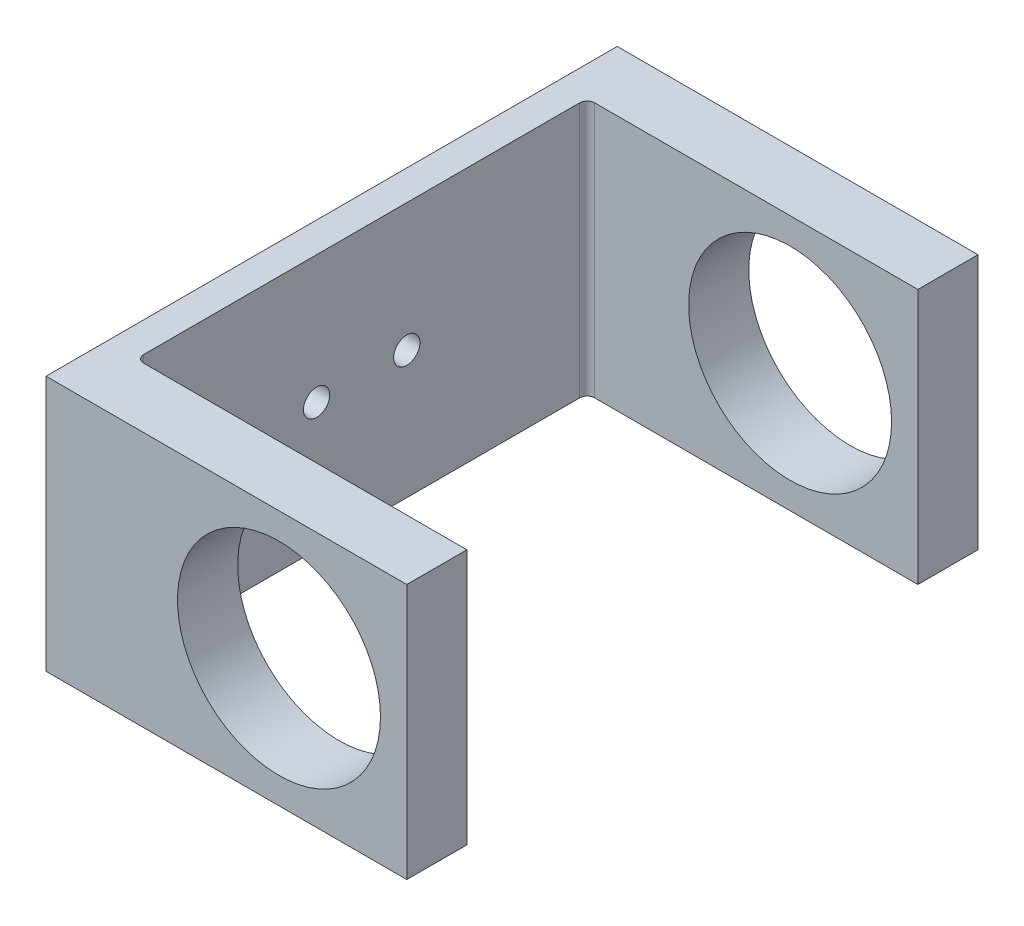
ISO-10303-21;
HEADER;
FILE_DESCRIPTION(('STEP AP214'),'2;1');
FILE_NAME('part.step','',(''),(''),'','','');
FILE_SCHEMA(('AUTOMOTIVE_DESIGN { 1 0 10303 214 1 1 1 1 }'));
ENDSEC;
DATA;
#1=APPLICATION_CONTEXT('core data for automotive mechanical design processes');
#2=APPLICATION_PROTOCOL_DEFINITION('international standard','automotive_design',2000,#1);
#3=PRODUCT_CONTEXT('',#1,'mechanical');
#4=PRODUCT('Part','Part','',(#3));
#5=PRODUCT_RELATED_PRODUCT_CATEGORY('part','',(#4));
#6=PRODUCT_DEFINITION_FORMATION('','',#4);
#7=PRODUCT_DEFINITION_CONTEXT('part definition',#1,'design');
#8=PRODUCT_DEFINITION('design','',#6,#7);
#9=PRODUCT_DEFINITION_SHAPE('','',#8);
#10=(LENGTH_UNIT() NAMED_UNIT(*) SI_UNIT(.MILLI.,.METRE.));
#11=(NAMED_UNIT(*) PLANE_ANGLE_UNIT() SI_UNIT($,.RADIAN.));
#12=(NAMED_UNIT(*) SI_UNIT($,.STERADIAN.) SOLID_ANGLE_UNIT());
#13=UNCERTAINTY_MEASURE_WITH_UNIT(LENGTH_MEASURE(1.E-05),#10,'distance_accuracy_value','');
#14=(GEOMETRIC_REPRESENTATION_CONTEXT(3) GLOBAL_UNCERTAINTY_ASSIGNED_CONTEXT((#13)) GLOBAL_UNIT_ASSIGNED_CONTEXT((#10,
#11,#12)) REPRESENTATION_CONTEXT('',''));
#15=CARTESIAN_POINT('',(0.,0.,0.));
#16=DIRECTION('',(0.,0.,1.));
#17=DIRECTION('',(1.,0.,0.));
#18=AXIS2_PLACEMENT_3D('',#15,#16,#17);
#19=CARTESIAN_POINT('',(-4.,-17.,30.));
#20=DIRECTION('',(0.,-1.,0.));
#21=DIRECTION('',(0.,0.,-1.));
#22=AXIS2_PLACEMENT_3D('',#19,#20,#21);
#23=PLANE('',#22);
#24=DIRECTION('',(0.,0.,-1.));
#25=VECTOR('',#24,1.);
#26=CARTESIAN_POINT('',(0.,-17.,30.));
#27=LINE('',#26,#25);
#28=CARTESIAN_POINT('',(0.,-17.,29.));
#29=VERTEX_POINT('',#28);
#30=CARTESIAN_POINT('',(0.,-17.,-29.));
#31=VERTEX_POINT('',#30);
#32=EDGE_CURVE('E128',#29,#31,#27,.T.);
#33=ORIENTED_EDGE('',*,*,#32,.F.);
#34=CARTESIAN_POINT('',(1.,-17.,29.));
#35=DIRECTION('',(0.,-1.,0.));
#36=DIRECTION('',(0.,0.,-1.));
#37=AXIS2_PLACEMENT_3D('',#34,#35,#36);
#38=CIRCLE('',#37,1.);
#39=CARTESIAN_POINT('',(1.,-17.,30.));
#40=VERTEX_POINT('',#39);
#41=EDGE_CURVE('E236',#29,#40,#38,.F.);
#42=ORIENTED_EDGE('',*,*,#41,.T.);
#43=DIRECTION('',(1.,0.,0.));
#44=VECTOR('',#43,1.);
#45=CARTESIAN_POINT('',(-4.,-17.,30.));
#46=LINE('',#45,#44);
#47=CARTESIAN_POINT('',(44.,-17.,30.));
#48=VERTEX_POINT('',#47);
#49=EDGE_CURVE('E173',#40,#48,#46,.T.);
#50=ORIENTED_EDGE('',*,*,#49,.T.);
#51=DIRECTION('',(0.,0.,-1.));
#52=VECTOR('',#51,1.);
#53=CARTESIAN_POINT('',(44.,-17.,38.));
#54=LINE('',#53,#52);
#55=CARTESIAN_POINT('',(44.,-17.,38.));
#56=VERTEX_POINT('',#55);
#57=EDGE_CURVE('E201',#56,#48,#54,.T.);
#58=ORIENTED_EDGE('',*,*,#57,.F.);
#59=DIRECTION('',(1.,0.,0.));
#60=VECTOR('',#59,1.);
#61=CARTESIAN_POINT('',(-4.,-17.,38.));
#62=LINE('',#61,#60);
#63=CARTESIAN_POINT('',(-4.,-17.,38.));
#64=VERTEX_POINT('',#63);
#65=EDGE_CURVE('E179',#64,#56,#62,.T.);
#66=ORIENTED_EDGE('',*,*,#65,.F.);
#67=DIRECTION('',(0.,0.,-1.));
#68=VECTOR('',#67,1.);
#69=CARTESIAN_POINT('',(-4.,-17.,30.));
#70=LINE('',#69,#68);
#71=CARTESIAN_POINT('',(-4.,-17.,-38.));
#72=VERTEX_POINT('',#71);
#73=EDGE_CURVE('E127',#64,#72,#70,.T.);
#74=ORIENTED_EDGE('',*,*,#73,.T.);
#75=DIRECTION('',(1.,0.,0.));
#76=VECTOR('',#75,1.);
#77=CARTESIAN_POINT('',(-4.,-17.,-38.));
#78=LINE('',#77,#76);
#79=CARTESIAN_POINT('',(44.,-17.,-38.));
#80=VERTEX_POINT('',#79);
#81=EDGE_CURVE('E137',#72,#80,#78,.T.);
#82=ORIENTED_EDGE('',*,*,#81,.T.);
#83=DIRECTION('',(0.,0.,1.));
#84=VECTOR('',#83,1.);
#85=CARTESIAN_POINT('',(44.,-17.,-38.));
#86=LINE('',#85,#84);
#87=CARTESIAN_POINT('',(44.,-17.,-30.));
#88=VERTEX_POINT('',#87);
#89=EDGE_CURVE('E152',#80,#88,#86,.T.);
#90=ORIENTED_EDGE('',*,*,#89,.T.);
#91=DIRECTION('',(1.,0.,0.));
#92=VECTOR('',#91,1.);
#93=CARTESIAN_POINT('',(-4.,-17.,-30.));
#94=LINE('',#93,#92);
#95=CARTESIAN_POINT('',(1.,-17.,-30.));
#96=VERTEX_POINT('',#95);
#97=EDGE_CURVE('E139',#96,#88,#94,.T.);
#98=ORIENTED_EDGE('',*,*,#97,.F.);
#99=CARTESIAN_POINT('',(1.,-17.,-29.));
#100=DIRECTION('',(0.,-1.,0.));
#101=DIRECTION('',(0.,0.,-1.));
#102=AXIS2_PLACEMENT_3D('',#99,#100,#101);
#103=CIRCLE('',#102,1.);
#104=EDGE_CURVE('E11',#96,#31,#103,.F.);
#105=ORIENTED_EDGE('',*,*,#104,.T.);
#106=EDGE_LOOP('',(#33,#42,#50,#58,#66,#74,#82,#90,#98,#105));
#107=FACE_BOUND('',#106,.T.);
#108=ADVANCED_FACE('F39',(#107),#23,.T.);
#109=CARTESIAN_POINT('',(-4.,17.,30.));
#110=DIRECTION('',(0.,1.,0.));
#111=DIRECTION('',(0.,0.,1.));
#112=AXIS2_PLACEMENT_3D('',#109,#110,#111);
#113=PLANE('',#112);
#114=DIRECTION('',(0.,0.,1.));
#115=VECTOR('',#114,1.);
#116=CARTESIAN_POINT('',(0.,17.,30.));
#117=LINE('',#116,#115);
#118=CARTESIAN_POINT('',(0.,17.,-29.));
#119=VERTEX_POINT('',#118);
#120=CARTESIAN_POINT('',(0.,17.,29.));
#121=VERTEX_POINT('',#120);
#122=EDGE_CURVE('E218',#119,#121,#117,.T.);
#123=ORIENTED_EDGE('',*,*,#122,.F.);
#124=CARTESIAN_POINT('',(1.,17.,-29.));
#125=DIRECTION('',(0.,1.,0.));
#126=DIRECTION('',(0.,0.,1.));
#127=AXIS2_PLACEMENT_3D('',#124,#125,#126);
#128=CIRCLE('',#127,1.);
#129=CARTESIAN_POINT('',(1.,17.,-30.));
#130=VERTEX_POINT('',#129);
#131=EDGE_CURVE('E48',#119,#130,#128,.F.);
#132=ORIENTED_EDGE('',*,*,#131,.T.);
#133=DIRECTION('',(-1.,0.,0.));
#134=VECTOR('',#133,1.);
#135=CARTESIAN_POINT('',(-4.,17.,-30.));
#136=LINE('',#135,#134);
#137=CARTESIAN_POINT('',(44.,17.,-30.));
#138=VERTEX_POINT('',#137);
#139=EDGE_CURVE('E153',#138,#130,#136,.T.);
#140=ORIENTED_EDGE('',*,*,#139,.F.);
#141=DIRECTION('',(0.,0.,1.));
#142=VECTOR('',#141,1.);
#143=CARTESIAN_POINT('',(44.,17.,-38.));
#144=LINE('',#143,#142);
#145=CARTESIAN_POINT('',(44.,17.,-38.));
#146=VERTEX_POINT('',#145);
#147=EDGE_CURVE('E142',#146,#138,#144,.T.);
#148=ORIENTED_EDGE('',*,*,#147,.F.);
#149=DIRECTION('',(-1.,0.,0.));
#150=VECTOR('',#149,1.);
#151=CARTESIAN_POINT('',(-4.,17.,-38.));
#152=LINE('',#151,#150);
#153=CARTESIAN_POINT('',(-4.,17.,-38.));
#154=VERTEX_POINT('',#153);
#155=EDGE_CURVE('E134',#146,#154,#152,.T.);
#156=ORIENTED_EDGE('',*,*,#155,.T.);
#157=DIRECTION('',(0.,0.,1.));
#158=VECTOR('',#157,1.);
#159=CARTESIAN_POINT('',(-4.,17.,30.));
#160=LINE('',#159,#158);
#161=CARTESIAN_POINT('',(-4.,17.,38.));
#162=VERTEX_POINT('',#161);
#163=EDGE_CURVE('E116',#154,#162,#160,.T.);
#164=ORIENTED_EDGE('',*,*,#163,.T.);
#165=DIRECTION('',(-1.,0.,0.));
#166=VECTOR('',#165,1.);
#167=CARTESIAN_POINT('',(-4.,17.,38.));
#168=LINE('',#167,#166);
#169=CARTESIAN_POINT('',(44.,17.,38.));
#170=VERTEX_POINT('',#169);
#171=EDGE_CURVE('E186',#170,#162,#168,.T.);
#172=ORIENTED_EDGE('',*,*,#171,.F.);
#173=DIRECTION('',(0.,0.,-1.));
#174=VECTOR('',#173,1.);
#175=CARTESIAN_POINT('',(44.,17.,38.));
#176=LINE('',#175,#174);
#177=CARTESIAN_POINT('',(44.,17.,30.));
#178=VERTEX_POINT('',#177);
#179=EDGE_CURVE('E189',#170,#178,#176,.T.);
#180=ORIENTED_EDGE('',*,*,#179,.T.);
#181=DIRECTION('',(-1.,0.,0.));
#182=VECTOR('',#181,1.);
#183=CARTESIAN_POINT('',(-4.,17.,30.));
#184=LINE('',#183,#182);
#185=CARTESIAN_POINT('',(1.,17.,30.));
#186=VERTEX_POINT('',#185);
#187=EDGE_CURVE('E180',#178,#186,#184,.T.);
#188=ORIENTED_EDGE('',*,*,#187,.T.);
#189=CARTESIAN_POINT('',(1.,17.,29.));
#190=DIRECTION('',(0.,1.,0.));
#191=DIRECTION('',(0.,0.,1.));
#192=AXIS2_PLACEMENT_3D('',#189,#190,#191);
#193=CIRCLE('',#192,1.);
#194=EDGE_CURVE('E239',#186,#121,#193,.F.);
#195=ORIENTED_EDGE('',*,*,#194,.T.);
#196=EDGE_LOOP('',(#123,#132,#140,#148,#156,#164,#172,#180,#188,#195));
#197=FACE_BOUND('',#196,.T.);
#198=ADVANCED_FACE('F141',(#197),#113,.T.);
#199=CARTESIAN_POINT('',(-4.,0.,0.));
#200=DIRECTION('',(1.,0.,0.));
#201=DIRECTION('',(0.,0.,-1.));
#202=AXIS2_PLACEMENT_3D('',#199,#200,#201);
#203=PLANE('',#202);
#204=CARTESIAN_POINT('',(-4.,0.,-6.));
#205=DIRECTION('',(1.,0.,0.));
#206=DIRECTION('',(0.,0.,1.));
#207=AXIS2_PLACEMENT_3D('',#204,#205,#206);
#208=CIRCLE('',#207,1.75);
#209=CARTESIAN_POINT('',(-4.,0.,-4.25));
#210=VERTEX_POINT('',#209);
#211=EDGE_CURVE('E206',#210,#210,#208,.T.);
#212=ORIENTED_EDGE('',*,*,#211,.T.);
#213=EDGE_LOOP('',(#212));
#214=FACE_BOUND('',#213,.T.);
#215=CARTESIAN_POINT('',(-4.,0.,6.));
#216=DIRECTION('',(1.,0.,0.));
#217=DIRECTION('',(0.,0.,-1.));
#218=AXIS2_PLACEMENT_3D('',#215,#216,#217);
#219=CIRCLE('',#218,1.75);
#220=CARTESIAN_POINT('',(-4.,0.,4.25));
#221=VERTEX_POINT('',#220);
#222=EDGE_CURVE('E214',#221,#221,#219,.T.);
#223=ORIENTED_EDGE('',*,*,#222,.T.);
#224=EDGE_LOOP('',(#223));
#225=FACE_BOUND('',#224,.T.);
#226=ORIENTED_EDGE('',*,*,#163,.F.);
#227=DIRECTION('',(0.,-1.,0.));
#228=VECTOR('',#227,1.);
#229=CARTESIAN_POINT('',(-4.,17.,-38.));
#230=LINE('',#229,#228);
#231=EDGE_CURVE('E119',#154,#72,#230,.T.);
#232=ORIENTED_EDGE('',*,*,#231,.T.);
#233=ORIENTED_EDGE('',*,*,#73,.F.);
#234=DIRECTION('',(0.,-1.,0.));
#235=VECTOR('',#234,1.);
#236=CARTESIAN_POINT('',(-4.,17.,38.));
#237=LINE('',#236,#235);
#238=EDGE_CURVE('E122',#162,#64,#237,.T.);
#239=ORIENTED_EDGE('',*,*,#238,.F.);
#240=EDGE_LOOP('',(#226,#232,#233,#239));
#241=FACE_BOUND('',#240,.T.);
#242=ADVANCED_FACE('F118',(#214,#225,#241),#203,.F.);
#243=CARTESIAN_POINT('',(0.,0.,0.));
#244=DIRECTION('',(1.,0.,0.));
#245=DIRECTION('',(0.,0.,-1.));
#246=AXIS2_PLACEMENT_3D('',#243,#244,#245);
#247=PLANE('',#246);
#248=CARTESIAN_POINT('',(0.,0.,-6.));
#249=DIRECTION('',(1.,0.,0.));
#250=DIRECTION('',(0.,0.,1.));
#251=AXIS2_PLACEMENT_3D('',#248,#249,#250);
#252=CIRCLE('',#251,1.75);
#253=CARTESIAN_POINT('',(0.,0.,-4.25));
#254=VERTEX_POINT('',#253);
#255=EDGE_CURVE('E205',#254,#254,#252,.T.);
#256=ORIENTED_EDGE('',*,*,#255,.F.);
#257=EDGE_LOOP('',(#256));
#258=FACE_BOUND('',#257,.T.);
#259=CARTESIAN_POINT('',(0.,0.,6.));
#260=DIRECTION('',(1.,0.,0.));
#261=DIRECTION('',(0.,0.,-1.));
#262=AXIS2_PLACEMENT_3D('',#259,#260,#261);
#263=CIRCLE('',#262,1.75);
#264=CARTESIAN_POINT('',(0.,0.,4.25));
#265=VERTEX_POINT('',#264);
#266=EDGE_CURVE('E210',#265,#265,#263,.T.);
#267=ORIENTED_EDGE('',*,*,#266,.F.);
#268=EDGE_LOOP('',(#267));
#269=FACE_BOUND('',#268,.T.);
#270=ORIENTED_EDGE('',*,*,#32,.T.);
#271=DIRECTION('',(0.,1.,0.));
#272=VECTOR('',#271,1.);
#273=CARTESIAN_POINT('',(0.,0.,-29.));
#274=LINE('',#273,#272);
#275=EDGE_CURVE('E243',#31,#119,#274,.T.);
#276=ORIENTED_EDGE('',*,*,#275,.T.);
#277=ORIENTED_EDGE('',*,*,#122,.T.);
#278=DIRECTION('',(0.,-1.,0.));
#279=VECTOR('',#278,1.);
#280=CARTESIAN_POINT('',(0.,0.,29.));
#281=LINE('',#280,#279);
#282=EDGE_CURVE('E224',#121,#29,#281,.T.);
#283=ORIENTED_EDGE('',*,*,#282,.T.);
#284=EDGE_LOOP('',(#270,#276,#277,#283));
#285=FACE_BOUND('',#284,.T.);
#286=ADVANCED_FACE('F251',(#258,#269,#285),#247,.T.);
#287=CARTESIAN_POINT('',(-4.,0.,6.));
#288=DIRECTION('',(1.,0.,0.));
#289=DIRECTION('',(0.,0.,-1.));
#290=AXIS2_PLACEMENT_3D('',#287,#288,#289);
#291=CYLINDRICAL_SURFACE('',#290,1.75);
#292=ORIENTED_EDGE('',*,*,#222,.F.);
#293=EDGE_LOOP('',(#292));
#294=FACE_BOUND('',#293,.T.);
#295=ORIENTED_EDGE('',*,*,#266,.T.);
#296=EDGE_LOOP('',(#295));
#297=FACE_BOUND('',#296,.T.);
#298=ADVANCED_FACE('F277',(#294,#297),#291,.F.);
#299=CARTESIAN_POINT('',(-4.,0.,-6.));
#300=DIRECTION('',(1.,0.,0.));
#301=DIRECTION('',(0.,0.,-1.));
#302=AXIS2_PLACEMENT_3D('',#299,#300,#301);
#303=CYLINDRICAL_SURFACE('',#302,1.75);
#304=ORIENTED_EDGE('',*,*,#211,.F.);
#305=EDGE_LOOP('',(#304));
#306=FACE_BOUND('',#305,.T.);
#307=ORIENTED_EDGE('',*,*,#255,.T.);
#308=EDGE_LOOP('',(#307));
#309=FACE_BOUND('',#308,.T.);
#310=ADVANCED_FACE('F284',(#306,#309),#303,.F.);
#311=CARTESIAN_POINT('',(0.,0.,38.));
#312=DIRECTION('',(0.,0.,1.));
#313=DIRECTION('',(1.,0.,0.));
#314=AXIS2_PLACEMENT_3D('',#311,#312,#313);
#315=PLANE('',#314);
#316=ORIENTED_EDGE('',*,*,#238,.T.);
#317=ORIENTED_EDGE('',*,*,#65,.T.);
#318=DIRECTION('',(0.,1.,0.));
#319=VECTOR('',#318,1.);
#320=CARTESIAN_POINT('',(44.,17.,38.));
#321=LINE('',#320,#319);
#322=EDGE_CURVE('E183',#56,#170,#321,.T.);
#323=ORIENTED_EDGE('',*,*,#322,.T.);
#324=ORIENTED_EDGE('',*,*,#171,.T.);
#325=EDGE_LOOP('',(#316,#317,#323,#324));
#326=FACE_BOUND('',#325,.T.);
#327=CARTESIAN_POINT('',(27.,0.,38.));
#328=DIRECTION('',(0.,0.,1.));
#329=DIRECTION('',(1.,0.,0.));
#330=AXIS2_PLACEMENT_3D('',#327,#328,#329);
#331=CIRCLE('',#330,13.5);
#332=CARTESIAN_POINT('',(40.5,0.,38.));
#333=VERTEX_POINT('',#332);
#334=EDGE_CURVE('E169',#333,#333,#331,.T.);
#335=ORIENTED_EDGE('',*,*,#334,.F.);
#336=EDGE_LOOP('',(#335));
#337=FACE_BOUND('',#336,.T.);
#338=ADVANCED_FACE('F288',(#326,#337),#315,.T.);
#339=CARTESIAN_POINT('',(0.,0.,30.));
#340=DIRECTION('',(0.,0.,1.));
#341=DIRECTION('',(1.,0.,0.));
#342=AXIS2_PLACEMENT_3D('',#339,#340,#341);
#343=PLANE('',#342);
#344=ORIENTED_EDGE('',*,*,#49,.F.);
#345=DIRECTION('',(0.,-1.,0.));
#346=VECTOR('',#345,1.);
#347=CARTESIAN_POINT('',(1.,0.,30.));
#348=LINE('',#347,#346);
#349=EDGE_CURVE('E233',#40,#186,#348,.F.);
#350=ORIENTED_EDGE('',*,*,#349,.T.);
#351=ORIENTED_EDGE('',*,*,#187,.F.);
#352=DIRECTION('',(0.,1.,0.));
#353=VECTOR('',#352,1.);
#354=CARTESIAN_POINT('',(44.,17.,30.));
#355=LINE('',#354,#353);
#356=EDGE_CURVE('E192',#48,#178,#355,.T.);
#357=ORIENTED_EDGE('',*,*,#356,.F.);
#358=EDGE_LOOP('',(#344,#350,#351,#357));
#359=FACE_BOUND('',#358,.T.);
#360=CARTESIAN_POINT('',(27.,0.,30.));
#361=DIRECTION('',(0.,0.,1.));
#362=DIRECTION('',(1.,0.,0.));
#363=AXIS2_PLACEMENT_3D('',#360,#361,#362);
#364=CIRCLE('',#363,13.5);
#365=CARTESIAN_POINT('',(40.5,0.,30.));
#366=VERTEX_POINT('',#365);
#367=EDGE_CURVE('E168',#366,#366,#364,.T.);
#368=ORIENTED_EDGE('',*,*,#367,.T.);
#369=EDGE_LOOP('',(#368));
#370=FACE_BOUND('',#369,.T.);
#371=ADVANCED_FACE('F294',(#359,#370),#343,.F.);
#372=CARTESIAN_POINT('',(44.,17.,38.));
#373=DIRECTION('',(-1.,0.,0.));
#374=DIRECTION('',(0.,-1.,0.));
#375=AXIS2_PLACEMENT_3D('',#372,#373,#374);
#376=PLANE('',#375);
#377=ORIENTED_EDGE('',*,*,#356,.T.);
#378=ORIENTED_EDGE('',*,*,#179,.F.);
#379=ORIENTED_EDGE('',*,*,#322,.F.);
#380=ORIENTED_EDGE('',*,*,#57,.T.);
#381=EDGE_LOOP('',(#377,#378,#379,#380));
#382=FACE_BOUND('',#381,.T.);
#383=ADVANCED_FACE('F290',(#382),#376,.F.);
#384=CARTESIAN_POINT('',(27.,0.,38.));
#385=DIRECTION('',(0.,0.,-1.));
#386=DIRECTION('',(-1.,0.,0.));
#387=AXIS2_PLACEMENT_3D('',#384,#385,#386);
#388=CYLINDRICAL_SURFACE('',#387,13.5);
#389=ORIENTED_EDGE('',*,*,#334,.T.);
#390=EDGE_LOOP('',(#389));
#391=FACE_BOUND('',#390,.T.);
#392=ORIENTED_EDGE('',*,*,#367,.F.);
#393=EDGE_LOOP('',(#392));
#394=FACE_BOUND('',#393,.T.);
#395=ADVANCED_FACE('F293',(#391,#394),#388,.F.);
#396=CARTESIAN_POINT('',(44.,17.,-38.));
#397=DIRECTION('',(1.,0.,0.));
#398=DIRECTION('',(0.,1.,0.));
#399=AXIS2_PLACEMENT_3D('',#396,#397,#398);
#400=PLANE('',#399);
#401=DIRECTION('',(0.,1.,0.));
#402=VECTOR('',#401,1.);
#403=CARTESIAN_POINT('',(44.,17.,-30.));
#404=LINE('',#403,#402);
#405=EDGE_CURVE('E156',#88,#138,#404,.T.);
#406=ORIENTED_EDGE('',*,*,#405,.F.);
#407=ORIENTED_EDGE('',*,*,#89,.F.);
#408=DIRECTION('',(0.,1.,0.));
#409=VECTOR('',#408,1.);
#410=CARTESIAN_POINT('',(44.,17.,-38.));
#411=LINE('',#410,#409);
#412=EDGE_CURVE('E144',#80,#146,#411,.T.);
#413=ORIENTED_EDGE('',*,*,#412,.T.);
#414=ORIENTED_EDGE('',*,*,#147,.T.);
#415=EDGE_LOOP('',(#406,#407,#413,#414));
#416=FACE_BOUND('',#415,.T.);
#417=ADVANCED_FACE('F304',(#416),#400,.T.);
#418=CARTESIAN_POINT('',(0.,0.,-38.));
#419=DIRECTION('',(0.,0.,-1.));
#420=DIRECTION('',(1.,0.,0.));
#421=AXIS2_PLACEMENT_3D('',#418,#419,#420);
#422=PLANE('',#421);
#423=CARTESIAN_POINT('',(27.,0.,-38.));
#424=DIRECTION('',(0.,0.,1.));
#425=DIRECTION('',(1.,0.,0.));
#426=AXIS2_PLACEMENT_3D('',#423,#424,#425);
#427=CIRCLE('',#426,13.5);
#428=CARTESIAN_POINT('',(40.5,0.,-38.));
#429=VERTEX_POINT('',#428);
#430=EDGE_CURVE('E157',#429,#429,#427,.T.);
#431=ORIENTED_EDGE('',*,*,#430,.T.);
#432=EDGE_LOOP('',(#431));
#433=FACE_BOUND('',#432,.T.);
#434=ORIENTED_EDGE('',*,*,#231,.F.);
#435=ORIENTED_EDGE('',*,*,#155,.F.);
#436=ORIENTED_EDGE('',*,*,#412,.F.);
#437=ORIENTED_EDGE('',*,*,#81,.F.);
#438=EDGE_LOOP('',(#434,#435,#436,#437));
#439=FACE_BOUND('',#438,.T.);
#440=ADVANCED_FACE('F132',(#433,#439),#422,.T.);
#441=CARTESIAN_POINT('',(0.,0.,-30.));
#442=DIRECTION('',(0.,0.,-1.));
#443=DIRECTION('',(1.,0.,0.));
#444=AXIS2_PLACEMENT_3D('',#441,#442,#443);
#445=PLANE('',#444);
#446=ORIENTED_EDGE('',*,*,#139,.T.);
#447=DIRECTION('',(0.,1.,0.));
#448=VECTOR('',#447,1.);
#449=CARTESIAN_POINT('',(1.,0.,-30.));
#450=LINE('',#449,#448);
#451=EDGE_CURVE('E61',#130,#96,#450,.F.);
#452=ORIENTED_EDGE('',*,*,#451,.T.);
#453=ORIENTED_EDGE('',*,*,#97,.T.);
#454=ORIENTED_EDGE('',*,*,#405,.T.);
#455=EDGE_LOOP('',(#446,#452,#453,#454));
#456=FACE_BOUND('',#455,.T.);
#457=CARTESIAN_POINT('',(27.,0.,-30.));
#458=DIRECTION('',(0.,0.,1.));
#459=DIRECTION('',(1.,0.,0.));
#460=AXIS2_PLACEMENT_3D('',#457,#458,#459);
#461=CIRCLE('',#460,13.5);
#462=CARTESIAN_POINT('',(40.5,0.,-30.));
#463=VERTEX_POINT('',#462);
#464=EDGE_CURVE('E324',#463,#463,#461,.T.);
#465=ORIENTED_EDGE('',*,*,#464,.F.);
#466=EDGE_LOOP('',(#465));
#467=FACE_BOUND('',#466,.T.);
#468=ADVANCED_FACE('F309',(#456,#467),#445,.F.);
#469=CARTESIAN_POINT('',(27.,0.,-38.));
#470=DIRECTION('',(0.,0.,1.));
#471=DIRECTION('',(1.,0.,0.));
#472=AXIS2_PLACEMENT_3D('',#469,#470,#471);
#473=CYLINDRICAL_SURFACE('',#472,13.5);
#474=ORIENTED_EDGE('',*,*,#430,.F.);
#475=EDGE_LOOP('',(#474));
#476=FACE_BOUND('',#475,.T.);
#477=ORIENTED_EDGE('',*,*,#464,.T.);
#478=EDGE_LOOP('',(#477));
#479=FACE_BOUND('',#478,.T.);
#480=ADVANCED_FACE('F267',(#476,#479),#473,.F.);
#481=CARTESIAN_POINT('',(1.,0.,29.));
#482=DIRECTION('',(0.,-1.,0.));
#483=DIRECTION('',(0.,0.,-1.));
#484=AXIS2_PLACEMENT_3D('',#481,#482,#483);
#485=CYLINDRICAL_SURFACE('',#484,1.);
#486=ORIENTED_EDGE('',*,*,#194,.F.);
#487=ORIENTED_EDGE('',*,*,#349,.F.);
#488=ORIENTED_EDGE('',*,*,#41,.F.);
#489=ORIENTED_EDGE('',*,*,#282,.F.);
#490=EDGE_LOOP('',(#486,#487,#488,#489));
#491=FACE_BOUND('',#490,.T.);
#492=ADVANCED_FACE('F260',(#491),#485,.F.);
#493=CARTESIAN_POINT('',(1.,0.,-29.));
#494=DIRECTION('',(0.,1.,0.));
#495=DIRECTION('',(0.,0.,1.));
#496=AXIS2_PLACEMENT_3D('',#493,#494,#495);
#497=CYLINDRICAL_SURFACE('',#496,1.);
#498=ORIENTED_EDGE('',*,*,#104,.F.);
#499=ORIENTED_EDGE('',*,*,#451,.F.);
#500=ORIENTED_EDGE('',*,*,#131,.F.);
#501=ORIENTED_EDGE('',*,*,#275,.F.);
#502=EDGE_LOOP('',(#498,#499,#500,#501));
#503=FACE_BOUND('',#502,.T.);
#504=ADVANCED_FACE('F41',(#503),#497,.F.);
#505=CLOSED_SHELL('',(#108,#198,#242,#286,#298,#310,#338,#371,#383,#395,#417,#440,#468,#480,
#492,#504));
#506=MANIFOLD_SOLID_BREP('B2',#505);
#507=ADVANCED_BREP_SHAPE_REPRESENTATION('',(#18,#506),#14);
#508=SHAPE_DEFINITION_REPRESENTATION(#9,#507);
ENDSEC;
END-ISO-10303-21;
